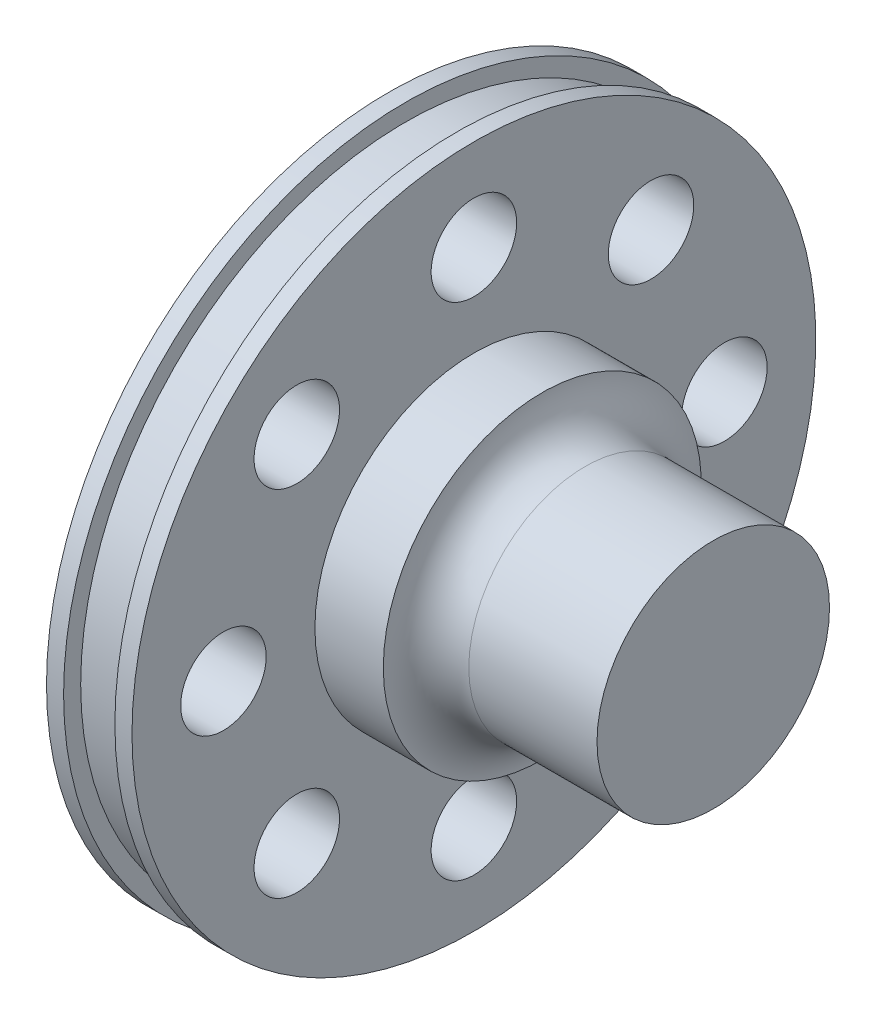
ISO-10303-21;
HEADER;
FILE_DESCRIPTION(('STEP AP214'),'2;1');
FILE_NAME('part.step','',(''),(''),'','','');
FILE_SCHEMA(('AUTOMOTIVE_DESIGN { 1 0 10303 214 1 1 1 1 }'));
ENDSEC;
DATA;
#1=APPLICATION_CONTEXT('core data for automotive mechanical design processes');
#2=APPLICATION_PROTOCOL_DEFINITION('international standard','automotive_design',2000,#1);
#3=PRODUCT_CONTEXT('',#1,'mechanical');
#4=PRODUCT('Part','Part','',(#3));
#5=PRODUCT_RELATED_PRODUCT_CATEGORY('part','',(#4));
#6=PRODUCT_DEFINITION_FORMATION('','',#4);
#7=PRODUCT_DEFINITION_CONTEXT('part definition',#1,'design');
#8=PRODUCT_DEFINITION('design','',#6,#7);
#9=PRODUCT_DEFINITION_SHAPE('','',#8);
#10=(LENGTH_UNIT() NAMED_UNIT(*) SI_UNIT(.MILLI.,.METRE.));
#11=(NAMED_UNIT(*) PLANE_ANGLE_UNIT() SI_UNIT($,.RADIAN.));
#12=(NAMED_UNIT(*) SI_UNIT($,.STERADIAN.) SOLID_ANGLE_UNIT());
#13=UNCERTAINTY_MEASURE_WITH_UNIT(LENGTH_MEASURE(1.E-05),#10,'distance_accuracy_value','');
#14=(GEOMETRIC_REPRESENTATION_CONTEXT(3) GLOBAL_UNCERTAINTY_ASSIGNED_CONTEXT((#13)) GLOBAL_UNIT_ASSIGNED_CONTEXT((#10,
#11,#12)) REPRESENTATION_CONTEXT('',''));
#15=CARTESIAN_POINT('',(0.,0.,0.));
#16=DIRECTION('',(0.,0.,1.));
#17=DIRECTION('',(1.,0.,0.));
#18=AXIS2_PLACEMENT_3D('',#15,#16,#17);
#19=CARTESIAN_POINT('',(45.72,17.272,0.));
#20=DIRECTION('',(-1.,0.,0.));
#21=DIRECTION('',(0.,0.,1.));
#22=AXIS2_PLACEMENT_3D('',#19,#20,#21);
#23=PLANE('',#22);
#24=CARTESIAN_POINT('',(45.72,0.,0.));
#25=DIRECTION('',(-1.,0.,0.));
#26=DIRECTION('',(0.,0.,1.));
#27=AXIS2_PLACEMENT_3D('',#24,#25,#26);
#28=CIRCLE('',#27,17.272);
#29=CARTESIAN_POINT('',(45.72,0.,17.272));
#30=VERTEX_POINT('',#29);
#31=EDGE_CURVE('E51',#30,#30,#28,.T.);
#32=ORIENTED_EDGE('',*,*,#31,.F.);
#33=EDGE_LOOP('',(#32));
#34=FACE_BOUND('',#33,.T.);
#35=ADVANCED_FACE('F43',(#34),#23,.F.);
#36=CARTESIAN_POINT('',(-1001.18476523303,0.,0.));
#37=DIRECTION('',(-1.,0.,0.));
#38=DIRECTION('',(0.,0.,1.));
#39=AXIS2_PLACEMENT_3D('',#36,#37,#38);
#40=CYLINDRICAL_SURFACE('',#39,17.272);
#41=CARTESIAN_POINT('',(26.67,0.,0.));
#42=DIRECTION('',(-1.,0.,0.));
#43=DIRECTION('',(0.,0.,1.));
#44=AXIS2_PLACEMENT_3D('',#41,#42,#43);
#45=CIRCLE('',#44,17.272);
#46=CARTESIAN_POINT('',(26.67,0.,17.272));
#47=VERTEX_POINT('',#46);
#48=EDGE_CURVE('E10',#47,#47,#45,.F.);
#49=ORIENTED_EDGE('',*,*,#48,.T.);
#50=EDGE_LOOP('',(#49));
#51=FACE_BOUND('',#50,.T.);
#52=ORIENTED_EDGE('',*,*,#31,.T.);
#53=EDGE_LOOP('',(#52));
#54=FACE_BOUND('',#53,.T.);
#55=ADVANCED_FACE('F181',(#51,#54),#40,.T.);
#56=CARTESIAN_POINT('',(-1001.18476523303,0.,0.));
#57=DIRECTION('',(-1.,0.,0.));
#58=DIRECTION('',(0.,0.,1.));
#59=AXIS2_PLACEMENT_3D('',#56,#57,#58);
#60=CYLINDRICAL_SURFACE('',#59,23.622);
#61=CARTESIAN_POINT('',(10.1599999999999,0.,0.));
#62=DIRECTION('',(-1.,0.,0.));
#63=DIRECTION('',(0.,0.,1.));
#64=AXIS2_PLACEMENT_3D('',#61,#62,#63);
#65=CIRCLE('',#64,23.622);
#66=CARTESIAN_POINT('',(10.1599999999999,0.,23.622));
#67=VERTEX_POINT('',#66);
#68=EDGE_CURVE('E61',#67,#67,#65,.T.);
#69=ORIENTED_EDGE('',*,*,#68,.F.);
#70=EDGE_LOOP('',(#69));
#71=FACE_BOUND('',#70,.T.);
#72=CARTESIAN_POINT('',(20.3199999999999,0.,0.));
#73=DIRECTION('',(-1.,0.,0.));
#74=DIRECTION('',(0.,0.,1.));
#75=AXIS2_PLACEMENT_3D('',#72,#73,#74);
#76=CIRCLE('',#75,23.622);
#77=CARTESIAN_POINT('',(20.3199999999999,0.,23.622));
#78=VERTEX_POINT('',#77);
#79=EDGE_CURVE('E56',#78,#78,#76,.T.);
#80=ORIENTED_EDGE('',*,*,#79,.T.);
#81=EDGE_LOOP('',(#80));
#82=FACE_BOUND('',#81,.T.);
#83=ADVANCED_FACE('F170',(#71,#82),#60,.T.);
#84=CARTESIAN_POINT('',(10.16,23.622,0.));
#85=DIRECTION('',(-1.,0.,0.));
#86=DIRECTION('',(0.,0.,1.));
#87=AXIS2_PLACEMENT_3D('',#84,#85,#86);
#88=PLANE('',#87);
#89=CARTESIAN_POINT('',(10.16,26.3121504347329,26.3121504347323));
#90=DIRECTION('',(1.,0.,0.));
#91=DIRECTION('',(0.,0.,-1.));
#92=AXIS2_PLACEMENT_3D('',#89,#90,#91);
#93=CIRCLE('',#92,6.35);
#94=CARTESIAN_POINT('',(10.16,26.3121504347329,19.9621504347323));
#95=VERTEX_POINT('',#94);
#96=EDGE_CURVE('E112',#95,#95,#93,.T.);
#97=ORIENTED_EDGE('',*,*,#96,.F.);
#98=EDGE_LOOP('',(#97));
#99=FACE_BOUND('',#98,.T.);
#100=CARTESIAN_POINT('',(10.16,3.73870896112223E-13,37.211));
#101=DIRECTION('',(1.,0.,0.));
#102=DIRECTION('',(0.,0.,-1.));
#103=AXIS2_PLACEMENT_3D('',#100,#101,#102);
#104=CIRCLE('',#103,6.35);
#105=CARTESIAN_POINT('',(10.16,3.73870896112223E-13,30.861));
#106=VERTEX_POINT('',#105);
#107=EDGE_CURVE('E120',#106,#106,#104,.T.);
#108=ORIENTED_EDGE('',*,*,#107,.F.);
#109=EDGE_LOOP('',(#108));
#110=FACE_BOUND('',#109,.T.);
#111=CARTESIAN_POINT('',(10.16,-26.3121504347324,26.3121504347328));
#112=DIRECTION('',(1.,0.,0.));
#113=DIRECTION('',(0.,0.,-1.));
#114=AXIS2_PLACEMENT_3D('',#111,#112,#113);
#115=CIRCLE('',#114,6.35);
#116=CARTESIAN_POINT('',(10.16,-26.3121504347324,19.9621504347328));
#117=VERTEX_POINT('',#116);
#118=EDGE_CURVE('E128',#117,#117,#115,.T.);
#119=ORIENTED_EDGE('',*,*,#118,.F.);
#120=EDGE_LOOP('',(#119));
#121=FACE_BOUND('',#120,.T.);
#122=CARTESIAN_POINT('',(10.16,-37.211,2.43949384012531E-13));
#123=DIRECTION('',(1.,0.,0.));
#124=DIRECTION('',(0.,0.,-1.));
#125=AXIS2_PLACEMENT_3D('',#122,#123,#124);
#126=CIRCLE('',#125,6.35);
#127=CARTESIAN_POINT('',(10.16,-37.211,-6.34999999999976));
#128=VERTEX_POINT('',#127);
#129=EDGE_CURVE('E136',#128,#128,#126,.T.);
#130=ORIENTED_EDGE('',*,*,#129,.F.);
#131=EDGE_LOOP('',(#130));
#132=FACE_BOUND('',#131,.T.);
#133=CARTESIAN_POINT('',(10.16,-26.3121504347328,-26.3121504347325));
#134=DIRECTION('',(1.,0.,0.));
#135=DIRECTION('',(0.,0.,-1.));
#136=AXIS2_PLACEMENT_3D('',#133,#134,#135);
#137=CIRCLE('',#136,6.35);
#138=CARTESIAN_POINT('',(10.16,-26.3121504347328,-32.6621504347325));
#139=VERTEX_POINT('',#138);
#140=EDGE_CURVE('E144',#139,#139,#137,.T.);
#141=ORIENTED_EDGE('',*,*,#140,.F.);
#142=EDGE_LOOP('',(#141));
#143=FACE_BOUND('',#142,.T.);
#144=CARTESIAN_POINT('',(10.16,-1.07088978008932E-13,-37.211));
#145=DIRECTION('',(1.,0.,0.));
#146=DIRECTION('',(0.,0.,-1.));
#147=AXIS2_PLACEMENT_3D('',#144,#145,#146);
#148=CIRCLE('',#147,6.35);
#149=CARTESIAN_POINT('',(10.16,-1.07088978008932E-13,-43.561));
#150=VERTEX_POINT('',#149);
#151=EDGE_CURVE('E152',#150,#150,#148,.T.);
#152=ORIENTED_EDGE('',*,*,#151,.F.);
#153=EDGE_LOOP('',(#152));
#154=FACE_BOUND('',#153,.T.);
#155=CARTESIAN_POINT('',(10.16,26.3121504347326,-26.3121504347327));
#156=DIRECTION('',(1.,0.,0.));
#157=DIRECTION('',(0.,0.,-1.));
#158=AXIS2_PLACEMENT_3D('',#155,#156,#157);
#159=CIRCLE('',#158,6.35);
#160=CARTESIAN_POINT('',(10.16,26.3121504347326,-32.6621504347327));
#161=VERTEX_POINT('',#160);
#162=EDGE_CURVE('E104',#161,#161,#159,.T.);
#163=ORIENTED_EDGE('',*,*,#162,.F.);
#164=EDGE_LOOP('',(#163));
#165=FACE_BOUND('',#164,.T.);
#166=CARTESIAN_POINT('',(10.16,37.211,0.));
#167=DIRECTION('',(1.,0.,0.));
#168=DIRECTION('',(0.,0.,-1.));
#169=AXIS2_PLACEMENT_3D('',#166,#167,#168);
#170=CIRCLE('',#169,6.35);
#171=CARTESIAN_POINT('',(10.16,37.211,-6.34999999999998));
#172=VERTEX_POINT('',#171);
#173=EDGE_CURVE('E100',#172,#172,#170,.T.);
#174=ORIENTED_EDGE('',*,*,#173,.F.);
#175=EDGE_LOOP('',(#174));
#176=FACE_BOUND('',#175,.T.);
#177=CARTESIAN_POINT('',(10.1599999999999,0.,0.));
#178=DIRECTION('',(-1.,0.,0.));
#179=DIRECTION('',(0.,0.,1.));
#180=AXIS2_PLACEMENT_3D('',#177,#178,#179);
#181=CIRCLE('',#180,50.8);
#182=CARTESIAN_POINT('',(10.1599999999999,0.,50.8));
#183=VERTEX_POINT('',#182);
#184=EDGE_CURVE('E67',#183,#183,#181,.T.);
#185=ORIENTED_EDGE('',*,*,#184,.F.);
#186=EDGE_LOOP('',(#185));
#187=FACE_BOUND('',#186,.T.);
#188=ORIENTED_EDGE('',*,*,#68,.T.);
#189=EDGE_LOOP('',(#188));
#190=FACE_BOUND('',#189,.T.);
#191=ADVANCED_FACE('F166',(#99,#110,#121,#132,#143,#154,#165,#176,#187,#190),#88,.F.);
#192=CARTESIAN_POINT('',(-1001.18476523303,0.,0.));
#193=DIRECTION('',(-1.,0.,0.));
#194=DIRECTION('',(0.,0.,1.));
#195=AXIS2_PLACEMENT_3D('',#192,#193,#194);
#196=CYLINDRICAL_SURFACE('',#195,50.8);
#197=CARTESIAN_POINT('',(7.61999999999996,0.,0.));
#198=DIRECTION('',(-1.,0.,0.));
#199=DIRECTION('',(0.,0.,1.));
#200=AXIS2_PLACEMENT_3D('',#197,#198,#199);
#201=CIRCLE('',#200,50.8);
#202=CARTESIAN_POINT('',(7.61999999999996,0.,50.8));
#203=VERTEX_POINT('',#202);
#204=EDGE_CURVE('E71',#203,#203,#201,.T.);
#205=ORIENTED_EDGE('',*,*,#204,.F.);
#206=EDGE_LOOP('',(#205));
#207=FACE_BOUND('',#206,.T.);
#208=ORIENTED_EDGE('',*,*,#184,.T.);
#209=EDGE_LOOP('',(#208));
#210=FACE_BOUND('',#209,.T.);
#211=ADVANCED_FACE('F169',(#207,#210),#196,.T.);
#212=CARTESIAN_POINT('',(7.61999999999999,50.8,0.));
#213=DIRECTION('',(1.,0.,0.));
#214=DIRECTION('',(0.,0.,-1.));
#215=AXIS2_PLACEMENT_3D('',#212,#213,#214);
#216=PLANE('',#215);
#217=CARTESIAN_POINT('',(7.61999999999996,0.,0.));
#218=DIRECTION('',(-1.,0.,0.));
#219=DIRECTION('',(0.,0.,1.));
#220=AXIS2_PLACEMENT_3D('',#217,#218,#219);
#221=CIRCLE('',#220,48.26);
#222=CARTESIAN_POINT('',(7.61999999999996,0.,48.26));
#223=VERTEX_POINT('',#222);
#224=EDGE_CURVE('E75',#223,#223,#221,.T.);
#225=ORIENTED_EDGE('',*,*,#224,.F.);
#226=EDGE_LOOP('',(#225));
#227=FACE_BOUND('',#226,.T.);
#228=ORIENTED_EDGE('',*,*,#204,.T.);
#229=EDGE_LOOP('',(#228));
#230=FACE_BOUND('',#229,.T.);
#231=ADVANCED_FACE('F203',(#227,#230),#216,.F.);
#232=CARTESIAN_POINT('',(-1001.18476523303,0.,0.));
#233=DIRECTION('',(-1.,0.,0.));
#234=DIRECTION('',(0.,0.,1.));
#235=AXIS2_PLACEMENT_3D('',#232,#233,#234);
#236=CYLINDRICAL_SURFACE('',#235,48.26);
#237=CARTESIAN_POINT('',(0.,0.,0.));
#238=DIRECTION('',(-1.,0.,0.));
#239=DIRECTION('',(0.,0.,1.));
#240=AXIS2_PLACEMENT_3D('',#237,#238,#239);
#241=CIRCLE('',#240,48.26);
#242=CARTESIAN_POINT('',(0.,0.,48.26));
#243=VERTEX_POINT('',#242);
#244=EDGE_CURVE('E79',#243,#243,#241,.T.);
#245=ORIENTED_EDGE('',*,*,#244,.F.);
#246=EDGE_LOOP('',(#245));
#247=FACE_BOUND('',#246,.T.);
#248=ORIENTED_EDGE('',*,*,#224,.T.);
#249=EDGE_LOOP('',(#248));
#250=FACE_BOUND('',#249,.T.);
#251=ADVANCED_FACE('F207',(#247,#250),#236,.T.);
#252=CARTESIAN_POINT('',(0.,50.8,0.));
#253=DIRECTION('',(-1.,0.,0.));
#254=DIRECTION('',(0.,0.,1.));
#255=AXIS2_PLACEMENT_3D('',#252,#253,#254);
#256=PLANE('',#255);
#257=CARTESIAN_POINT('',(0.,0.,0.));
#258=DIRECTION('',(-1.,0.,0.));
#259=DIRECTION('',(0.,0.,1.));
#260=AXIS2_PLACEMENT_3D('',#257,#258,#259);
#261=CIRCLE('',#260,50.8);
#262=CARTESIAN_POINT('',(0.,0.,50.8));
#263=VERTEX_POINT('',#262);
#264=EDGE_CURVE('E83',#263,#263,#261,.T.);
#265=ORIENTED_EDGE('',*,*,#264,.F.);
#266=EDGE_LOOP('',(#265));
#267=FACE_BOUND('',#266,.T.);
#268=ORIENTED_EDGE('',*,*,#244,.T.);
#269=EDGE_LOOP('',(#268));
#270=FACE_BOUND('',#269,.T.);
#271=ADVANCED_FACE('F211',(#267,#270),#256,.F.);
#272=CARTESIAN_POINT('',(-1001.18476523303,0.,0.));
#273=DIRECTION('',(-1.,0.,0.));
#274=DIRECTION('',(0.,0.,1.));
#275=AXIS2_PLACEMENT_3D('',#272,#273,#274);
#276=CYLINDRICAL_SURFACE('',#275,50.8);
#277=CARTESIAN_POINT('',(-2.53999999999999,0.,0.));
#278=DIRECTION('',(-1.,0.,0.));
#279=DIRECTION('',(0.,0.,1.));
#280=AXIS2_PLACEMENT_3D('',#277,#278,#279);
#281=CIRCLE('',#280,50.8);
#282=CARTESIAN_POINT('',(-2.53999999999999,0.,50.8));
#283=VERTEX_POINT('',#282);
#284=EDGE_CURVE('E87',#283,#283,#281,.T.);
#285=ORIENTED_EDGE('',*,*,#284,.F.);
#286=EDGE_LOOP('',(#285));
#287=FACE_BOUND('',#286,.T.);
#288=ORIENTED_EDGE('',*,*,#264,.T.);
#289=EDGE_LOOP('',(#288));
#290=FACE_BOUND('',#289,.T.);
#291=ADVANCED_FACE('F215',(#287,#290),#276,.T.);
#292=CARTESIAN_POINT('',(-2.54,50.8,0.));
#293=DIRECTION('',(1.,0.,0.));
#294=DIRECTION('',(0.,0.,-1.));
#295=AXIS2_PLACEMENT_3D('',#292,#293,#294);
#296=PLANE('',#295);
#297=CARTESIAN_POINT('',(-2.53999999999999,26.3121504347329,26.3121504347323));
#298=DIRECTION('',(1.,0.,0.));
#299=DIRECTION('',(0.,0.,-1.));
#300=AXIS2_PLACEMENT_3D('',#297,#298,#299);
#301=CIRCLE('',#300,6.35);
#302=CARTESIAN_POINT('',(-2.53999999999999,26.3121504347329,19.9621504347323));
#303=VERTEX_POINT('',#302);
#304=EDGE_CURVE('E108',#303,#303,#301,.T.);
#305=ORIENTED_EDGE('',*,*,#304,.T.);
#306=EDGE_LOOP('',(#305));
#307=FACE_BOUND('',#306,.T.);
#308=CARTESIAN_POINT('',(-2.53999999999999,3.73870896112223E-13,37.211));
#309=DIRECTION('',(1.,0.,0.));
#310=DIRECTION('',(0.,0.,-1.));
#311=AXIS2_PLACEMENT_3D('',#308,#309,#310);
#312=CIRCLE('',#311,6.35);
#313=CARTESIAN_POINT('',(-2.53999999999999,3.73870896112223E-13,30.861));
#314=VERTEX_POINT('',#313);
#315=EDGE_CURVE('E116',#314,#314,#312,.T.);
#316=ORIENTED_EDGE('',*,*,#315,.T.);
#317=EDGE_LOOP('',(#316));
#318=FACE_BOUND('',#317,.T.);
#319=CARTESIAN_POINT('',(-2.53999999999999,-26.3121504347324,26.3121504347328));
#320=DIRECTION('',(1.,0.,0.));
#321=DIRECTION('',(0.,0.,-1.));
#322=AXIS2_PLACEMENT_3D('',#319,#320,#321);
#323=CIRCLE('',#322,6.35);
#324=CARTESIAN_POINT('',(-2.53999999999999,-26.3121504347324,19.9621504347328));
#325=VERTEX_POINT('',#324);
#326=EDGE_CURVE('E124',#325,#325,#323,.T.);
#327=ORIENTED_EDGE('',*,*,#326,.T.);
#328=EDGE_LOOP('',(#327));
#329=FACE_BOUND('',#328,.T.);
#330=CARTESIAN_POINT('',(-2.53999999999999,-37.211,2.43949384012531E-13));
#331=DIRECTION('',(1.,0.,0.));
#332=DIRECTION('',(0.,0.,-1.));
#333=AXIS2_PLACEMENT_3D('',#330,#331,#332);
#334=CIRCLE('',#333,6.35);
#335=CARTESIAN_POINT('',(-2.53999999999999,-37.211,-6.34999999999976));
#336=VERTEX_POINT('',#335);
#337=EDGE_CURVE('E132',#336,#336,#334,.T.);
#338=ORIENTED_EDGE('',*,*,#337,.T.);
#339=EDGE_LOOP('',(#338));
#340=FACE_BOUND('',#339,.T.);
#341=CARTESIAN_POINT('',(-2.53999999999999,-26.3121504347328,-26.3121504347325));
#342=DIRECTION('',(1.,0.,0.));
#343=DIRECTION('',(0.,0.,-1.));
#344=AXIS2_PLACEMENT_3D('',#341,#342,#343);
#345=CIRCLE('',#344,6.35);
#346=CARTESIAN_POINT('',(-2.53999999999999,-26.3121504347328,-32.6621504347325));
#347=VERTEX_POINT('',#346);
#348=EDGE_CURVE('E140',#347,#347,#345,.T.);
#349=ORIENTED_EDGE('',*,*,#348,.T.);
#350=EDGE_LOOP('',(#349));
#351=FACE_BOUND('',#350,.T.);
#352=CARTESIAN_POINT('',(-2.53999999999999,-1.07088978008932E-13,-37.211));
#353=DIRECTION('',(1.,0.,0.));
#354=DIRECTION('',(0.,0.,-1.));
#355=AXIS2_PLACEMENT_3D('',#352,#353,#354);
#356=CIRCLE('',#355,6.35);
#357=CARTESIAN_POINT('',(-2.53999999999999,-1.07088978008932E-13,-43.561));
#358=VERTEX_POINT('',#357);
#359=EDGE_CURVE('E148',#358,#358,#356,.T.);
#360=ORIENTED_EDGE('',*,*,#359,.T.);
#361=EDGE_LOOP('',(#360));
#362=FACE_BOUND('',#361,.T.);
#363=CARTESIAN_POINT('',(-2.53999999999999,26.3121504347326,-26.3121504347327));
#364=DIRECTION('',(1.,0.,0.));
#365=DIRECTION('',(0.,0.,-1.));
#366=AXIS2_PLACEMENT_3D('',#363,#364,#365);
#367=CIRCLE('',#366,6.35);
#368=CARTESIAN_POINT('',(-2.53999999999999,26.3121504347326,-32.6621504347327));
#369=VERTEX_POINT('',#368);
#370=EDGE_CURVE('E156',#369,#369,#367,.T.);
#371=ORIENTED_EDGE('',*,*,#370,.T.);
#372=EDGE_LOOP('',(#371));
#373=FACE_BOUND('',#372,.T.);
#374=CARTESIAN_POINT('',(-2.53999999999999,37.211,0.));
#375=DIRECTION('',(1.,0.,0.));
#376=DIRECTION('',(0.,0.,-1.));
#377=AXIS2_PLACEMENT_3D('',#374,#375,#376);
#378=CIRCLE('',#377,6.35);
#379=CARTESIAN_POINT('',(-2.53999999999999,37.211,-6.34999999999998));
#380=VERTEX_POINT('',#379);
#381=EDGE_CURVE('E99',#380,#380,#378,.T.);
#382=ORIENTED_EDGE('',*,*,#381,.T.);
#383=EDGE_LOOP('',(#382));
#384=FACE_BOUND('',#383,.T.);
#385=CARTESIAN_POINT('',(-2.53999999999999,0.,0.));
#386=DIRECTION('',(-1.,0.,0.));
#387=DIRECTION('',(0.,0.,1.));
#388=AXIS2_PLACEMENT_3D('',#385,#386,#387);
#389=CIRCLE('',#388,12.7);
#390=CARTESIAN_POINT('',(-2.53999999999999,0.,12.7));
#391=VERTEX_POINT('',#390);
#392=EDGE_CURVE('E91',#391,#391,#389,.T.);
#393=ORIENTED_EDGE('',*,*,#392,.F.);
#394=EDGE_LOOP('',(#393));
#395=FACE_BOUND('',#394,.T.);
#396=ORIENTED_EDGE('',*,*,#284,.T.);
#397=EDGE_LOOP('',(#396));
#398=FACE_BOUND('',#397,.T.);
#399=ADVANCED_FACE('F219',(#307,#318,#329,#340,#351,#362,#373,#384,#395,#398),#296,.F.);
#400=CARTESIAN_POINT('',(-1001.18476523303,0.,0.));
#401=DIRECTION('',(-1.,0.,0.));
#402=DIRECTION('',(0.,0.,1.));
#403=AXIS2_PLACEMENT_3D('',#400,#401,#402);
#404=CYLINDRICAL_SURFACE('',#403,12.7);
#405=CARTESIAN_POINT('',(0.,0.,0.));
#406=DIRECTION('',(-1.,0.,0.));
#407=DIRECTION('',(0.,0.,1.));
#408=AXIS2_PLACEMENT_3D('',#405,#406,#407);
#409=CIRCLE('',#408,12.7);
#410=CARTESIAN_POINT('',(0.,0.,12.7));
#411=VERTEX_POINT('',#410);
#412=EDGE_CURVE('E95',#411,#411,#409,.T.);
#413=ORIENTED_EDGE('',*,*,#412,.F.);
#414=EDGE_LOOP('',(#413));
#415=FACE_BOUND('',#414,.T.);
#416=ORIENTED_EDGE('',*,*,#392,.T.);
#417=EDGE_LOOP('',(#416));
#418=FACE_BOUND('',#417,.T.);
#419=ADVANCED_FACE('F223',(#415,#418),#404,.F.);
#420=CARTESIAN_POINT('',(0.,12.7,0.));
#421=DIRECTION('',(1.,0.,0.));
#422=DIRECTION('',(0.,0.,-1.));
#423=AXIS2_PLACEMENT_3D('',#420,#421,#422);
#424=PLANE('',#423);
#425=ORIENTED_EDGE('',*,*,#412,.T.);
#426=EDGE_LOOP('',(#425));
#427=FACE_BOUND('',#426,.T.);
#428=ADVANCED_FACE('F227',(#427),#424,.F.);
#429=CARTESIAN_POINT('',(-2.53999999999999,37.211,0.));
#430=DIRECTION('',(1.,0.,0.));
#431=DIRECTION('',(0.,0.,-1.));
#432=AXIS2_PLACEMENT_3D('',#429,#430,#431);
#433=CYLINDRICAL_SURFACE('',#432,6.35);
#434=ORIENTED_EDGE('',*,*,#381,.F.);
#435=EDGE_LOOP('',(#434));
#436=FACE_BOUND('',#435,.T.);
#437=ORIENTED_EDGE('',*,*,#173,.T.);
#438=EDGE_LOOP('',(#437));
#439=FACE_BOUND('',#438,.T.);
#440=ADVANCED_FACE('F231',(#436,#439),#433,.F.);
#441=CARTESIAN_POINT('',(-2.53999999999999,26.3121504347326,-26.3121504347327));
#442=DIRECTION('',(1.,0.,0.));
#443=DIRECTION('',(0.,0.,-1.));
#444=AXIS2_PLACEMENT_3D('',#441,#442,#443);
#445=CYLINDRICAL_SURFACE('',#444,6.35);
#446=ORIENTED_EDGE('',*,*,#370,.F.);
#447=EDGE_LOOP('',(#446));
#448=FACE_BOUND('',#447,.T.);
#449=ORIENTED_EDGE('',*,*,#162,.T.);
#450=EDGE_LOOP('',(#449));
#451=FACE_BOUND('',#450,.T.);
#452=ADVANCED_FACE('F164',(#448,#451),#445,.F.);
#453=CARTESIAN_POINT('',(-2.53999999999999,-1.07088978008932E-13,-37.211));
#454=DIRECTION('',(1.,0.,0.));
#455=DIRECTION('',(0.,0.,-1.));
#456=AXIS2_PLACEMENT_3D('',#453,#454,#455);
#457=CYLINDRICAL_SURFACE('',#456,6.35);
#458=ORIENTED_EDGE('',*,*,#359,.F.);
#459=EDGE_LOOP('',(#458));
#460=FACE_BOUND('',#459,.T.);
#461=ORIENTED_EDGE('',*,*,#151,.T.);
#462=EDGE_LOOP('',(#461));
#463=FACE_BOUND('',#462,.T.);
#464=ADVANCED_FACE('F250',(#460,#463),#457,.F.);
#465=CARTESIAN_POINT('',(-2.53999999999999,-26.3121504347328,-26.3121504347325));
#466=DIRECTION('',(1.,0.,0.));
#467=DIRECTION('',(0.,0.,-1.));
#468=AXIS2_PLACEMENT_3D('',#465,#466,#467);
#469=CYLINDRICAL_SURFACE('',#468,6.35);
#470=ORIENTED_EDGE('',*,*,#348,.F.);
#471=EDGE_LOOP('',(#470));
#472=FACE_BOUND('',#471,.T.);
#473=ORIENTED_EDGE('',*,*,#140,.T.);
#474=EDGE_LOOP('',(#473));
#475=FACE_BOUND('',#474,.T.);
#476=ADVANCED_FACE('F246',(#472,#475),#469,.F.);
#477=CARTESIAN_POINT('',(-2.53999999999999,-37.211,2.43949384012531E-13));
#478=DIRECTION('',(1.,0.,0.));
#479=DIRECTION('',(0.,0.,-1.));
#480=AXIS2_PLACEMENT_3D('',#477,#478,#479);
#481=CYLINDRICAL_SURFACE('',#480,6.35);
#482=ORIENTED_EDGE('',*,*,#337,.F.);
#483=EDGE_LOOP('',(#482));
#484=FACE_BOUND('',#483,.T.);
#485=ORIENTED_EDGE('',*,*,#129,.T.);
#486=EDGE_LOOP('',(#485));
#487=FACE_BOUND('',#486,.T.);
#488=ADVANCED_FACE('F242',(#484,#487),#481,.F.);
#489=CARTESIAN_POINT('',(-2.53999999999999,-26.3121504347324,26.3121504347328));
#490=DIRECTION('',(1.,0.,0.));
#491=DIRECTION('',(0.,0.,-1.));
#492=AXIS2_PLACEMENT_3D('',#489,#490,#491);
#493=CYLINDRICAL_SURFACE('',#492,6.35);
#494=ORIENTED_EDGE('',*,*,#326,.F.);
#495=EDGE_LOOP('',(#494));
#496=FACE_BOUND('',#495,.T.);
#497=ORIENTED_EDGE('',*,*,#118,.T.);
#498=EDGE_LOOP('',(#497));
#499=FACE_BOUND('',#498,.T.);
#500=ADVANCED_FACE('F238',(#496,#499),#493,.F.);
#501=CARTESIAN_POINT('',(-2.53999999999999,3.73870896112223E-13,37.211));
#502=DIRECTION('',(1.,0.,0.));
#503=DIRECTION('',(0.,0.,-1.));
#504=AXIS2_PLACEMENT_3D('',#501,#502,#503);
#505=CYLINDRICAL_SURFACE('',#504,6.35);
#506=ORIENTED_EDGE('',*,*,#315,.F.);
#507=EDGE_LOOP('',(#506));
#508=FACE_BOUND('',#507,.T.);
#509=ORIENTED_EDGE('',*,*,#107,.T.);
#510=EDGE_LOOP('',(#509));
#511=FACE_BOUND('',#510,.T.);
#512=ADVANCED_FACE('F192',(#508,#511),#505,.F.);
#513=CARTESIAN_POINT('',(-2.53999999999999,26.3121504347329,26.3121504347323));
#514=DIRECTION('',(1.,0.,0.));
#515=DIRECTION('',(0.,0.,-1.));
#516=AXIS2_PLACEMENT_3D('',#513,#514,#515);
#517=CYLINDRICAL_SURFACE('',#516,6.35);
#518=ORIENTED_EDGE('',*,*,#304,.F.);
#519=EDGE_LOOP('',(#518));
#520=FACE_BOUND('',#519,.T.);
#521=ORIENTED_EDGE('',*,*,#96,.T.);
#522=EDGE_LOOP('',(#521));
#523=FACE_BOUND('',#522,.T.);
#524=ADVANCED_FACE('F186',(#520,#523),#517,.F.);
#525=CARTESIAN_POINT('',(26.67,0.,0.));
#526=DIRECTION('',(-1.,0.,0.));
#527=DIRECTION('',(0.,0.,1.));
#528=AXIS2_PLACEMENT_3D('',#525,#526,#527);
#529=TOROIDAL_SURFACE('',#528,23.622,6.35);
#530=ORIENTED_EDGE('',*,*,#48,.F.);
#531=EDGE_LOOP('',(#530));
#532=FACE_BOUND('',#531,.T.);
#533=ORIENTED_EDGE('',*,*,#79,.F.);
#534=EDGE_LOOP('',(#533));
#535=FACE_BOUND('',#534,.T.);
#536=ADVANCED_FACE('F45',(#532,#535),#529,.F.);
#537=CLOSED_SHELL('',(#35,#55,#83,#191,#211,#231,#251,#271,#291,#399,#419,#428,#440,#452,#464,
#476,#488,#500,#512,#524,#536));
#538=MANIFOLD_SOLID_BREP('B2',#537);
#539=ADVANCED_BREP_SHAPE_REPRESENTATION('',(#18,#538),#14);
#540=SHAPE_DEFINITION_REPRESENTATION(#9,#539);
ENDSEC;
END-ISO-10303-21;
